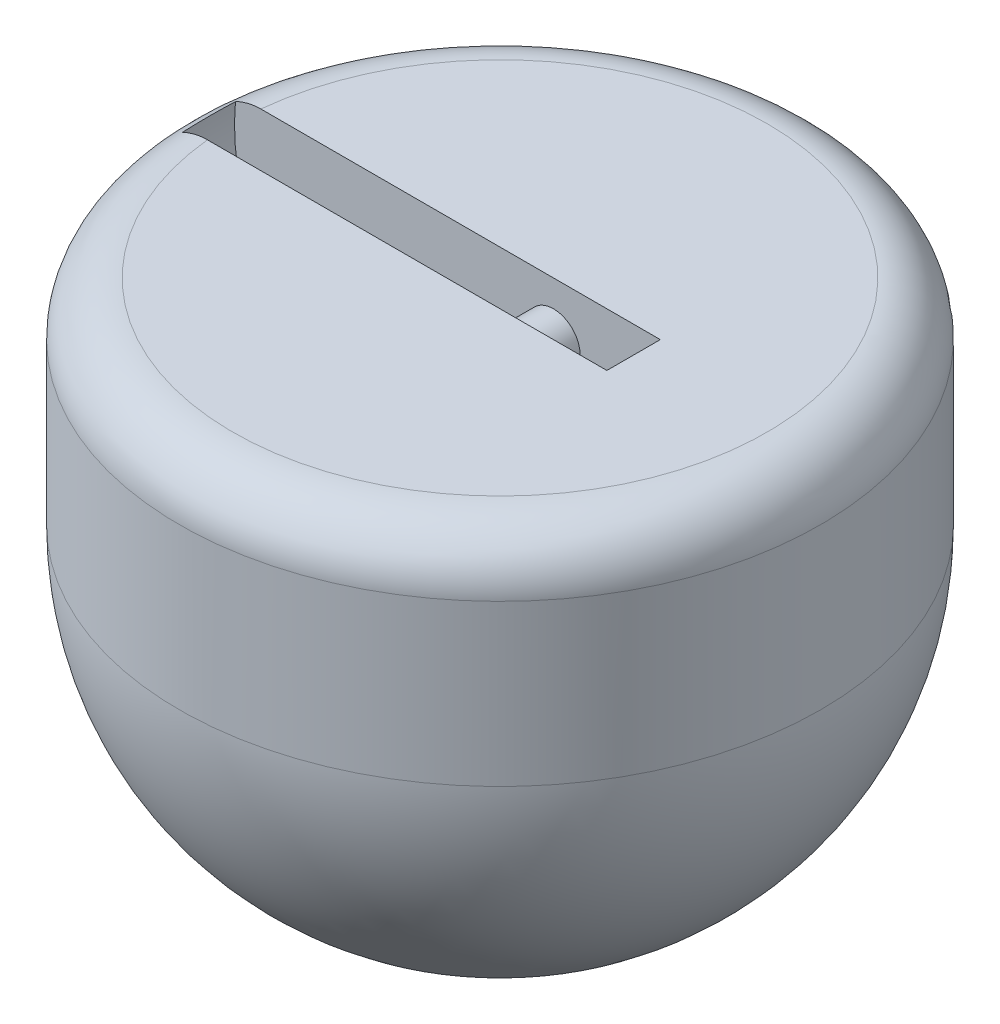
ISO-10303-21;
HEADER;
FILE_DESCRIPTION(('STEP AP214'),'2;1');
FILE_NAME('part.step','',(''),(''),'','','');
FILE_SCHEMA(('AUTOMOTIVE_DESIGN { 1 0 10303 214 1 1 1 1 }'));
ENDSEC;
DATA;
#1=APPLICATION_CONTEXT('core data for automotive mechanical design processes');
#2=APPLICATION_PROTOCOL_DEFINITION('international standard','automotive_design',2000,#1);
#3=PRODUCT_CONTEXT('',#1,'mechanical');
#4=PRODUCT('Part','Part','',(#3));
#5=PRODUCT_RELATED_PRODUCT_CATEGORY('part','',(#4));
#6=PRODUCT_DEFINITION_FORMATION('','',#4);
#7=PRODUCT_DEFINITION_CONTEXT('part definition',#1,'design');
#8=PRODUCT_DEFINITION('design','',#6,#7);
#9=PRODUCT_DEFINITION_SHAPE('','',#8);
#10=(LENGTH_UNIT() NAMED_UNIT(*) SI_UNIT(.MILLI.,.METRE.));
#11=(NAMED_UNIT(*) PLANE_ANGLE_UNIT() SI_UNIT($,.RADIAN.));
#12=(NAMED_UNIT(*) SI_UNIT($,.STERADIAN.) SOLID_ANGLE_UNIT());
#13=UNCERTAINTY_MEASURE_WITH_UNIT(LENGTH_MEASURE(1.E-05),#10,'distance_accuracy_value','');
#14=(GEOMETRIC_REPRESENTATION_CONTEXT(3) GLOBAL_UNCERTAINTY_ASSIGNED_CONTEXT((#13)) GLOBAL_UNIT_ASSIGNED_CONTEXT((#10,
#11,#12)) REPRESENTATION_CONTEXT('',''));
#15=CARTESIAN_POINT('',(0.,0.,0.));
#16=DIRECTION('',(0.,0.,1.));
#17=DIRECTION('',(1.,0.,0.));
#18=AXIS2_PLACEMENT_3D('',#15,#16,#17);
#19=CARTESIAN_POINT('',(0.,0.,0.));
#20=DIRECTION('',(0.,1.,0.));
#21=DIRECTION('',(0.,0.,1.));
#22=AXIS2_PLACEMENT_3D('',#19,#20,#21);
#23=PLANE('',#22);
#24=DIRECTION('',(-1.,0.,0.));
#25=VECTOR('',#24,1.);
#26=CARTESIAN_POINT('',(5.,0.,-1.));
#27=LINE('',#26,#25);
#28=CARTESIAN_POINT('',(5.,0.,-1.));
#29=VERTEX_POINT('',#28);
#30=CARTESIAN_POINT('',(-9.9498743710665,0.,-1.));
#31=VERTEX_POINT('',#30);
#32=EDGE_CURVE('E64',#29,#31,#27,.T.);
#33=ORIENTED_EDGE('',*,*,#32,.F.);
#34=DIRECTION('',(0.,0.,1.));
#35=VECTOR('',#34,1.);
#36=CARTESIAN_POINT('',(5.,0.,-1.));
#37=LINE('',#36,#35);
#38=CARTESIAN_POINT('',(5.,0.,1.));
#39=VERTEX_POINT('',#38);
#40=EDGE_CURVE('E85',#29,#39,#37,.T.);
#41=ORIENTED_EDGE('',*,*,#40,.T.);
#42=DIRECTION('',(-1.,0.,0.));
#43=VECTOR('',#42,1.);
#44=CARTESIAN_POINT('',(5.,0.,1.));
#45=LINE('',#44,#43);
#46=CARTESIAN_POINT('',(-9.9498743710665,0.,1.));
#47=VERTEX_POINT('',#46);
#48=EDGE_CURVE('E78',#39,#47,#45,.T.);
#49=ORIENTED_EDGE('',*,*,#48,.T.);
#50=CARTESIAN_POINT('',(0.,0.,0.));
#51=DIRECTION('',(0.,-1.,0.));
#52=DIRECTION('',(0.,0.,-1.));
#53=AXIS2_PLACEMENT_3D('',#50,#51,#52);
#54=CIRCLE('',#53,10.);
#55=EDGE_CURVE('E89',#31,#47,#54,.T.);
#56=ORIENTED_EDGE('',*,*,#55,.F.);
#57=EDGE_LOOP('',(#33,#41,#49,#56));
#58=FACE_BOUND('',#57,.T.);
#59=ADVANCED_FACE('F41',(#58),#23,.T.);
#60=CARTESIAN_POINT('',(0.,-2.,0.));
#61=DIRECTION('',(0.,-1.,0.));
#62=DIRECTION('',(0.,0.,-1.));
#63=AXIS2_PLACEMENT_3D('',#60,#61,#62);
#64=TOROIDAL_SURFACE('',#63,10.,2.);
#65=CARTESIAN_POINT('',(-10.8242334275043,-0.199297555043121,-1.));
#66=CARTESIAN_POINT('',(-10.9257054604038,-0.248139179035854,-1.));
#67=CARTESIAN_POINT('',(-11.0231377750794,-0.305557934567899,-1.));
#68=CARTESIAN_POINT('',(-11.2070704624869,-0.43597230631444,-1.));
#69=CARTESIAN_POINT('',(-11.2935580682294,-0.508985851904782,-1.));
#70=CARTESIAN_POINT('',(-11.4530114356367,-0.668497793270508,-1.));
#71=CARTESIAN_POINT('',(-11.5259813733455,-0.754992009175932,-1.));
#72=CARTESIAN_POINT('',(-11.6562962836318,-0.939010720145789,-1.));
#73=CARTESIAN_POINT('',(-11.7136451079299,-1.03653248772297,-1.));
#74=CARTESIAN_POINT('',(-11.8109532091549,-1.23958249116003,-1.));
#75=CARTESIAN_POINT('',(-11.8509577064683,-1.34508905400909,-1.));
#76=CARTESIAN_POINT('',(-11.9126368483875,-1.56133441106516,-1.));
#77=CARTESIAN_POINT('',(-11.9343110800122,-1.67207332309768,-1.));
#78=CARTESIAN_POINT('',(-11.9586679257183,-1.89533704689153,-1.));
#79=CARTESIAN_POINT('',(-11.9613982703355,-2.0078566537947,-1.));
#80=CARTESIAN_POINT('',(-11.9479150153787,-2.23175421810235,-1.));
#81=CARTESIAN_POINT('',(-11.9317015890207,-2.34313218593625,-1.));
#82=CARTESIAN_POINT('',(-11.8808176377737,-2.56150613587524,-1.));
#83=CARTESIAN_POINT('',(-11.8461599659228,-2.66850511367036,-1.));
#84=CARTESIAN_POINT('',(-11.7593943517058,-2.87517577070994,-1.));
#85=CARTESIAN_POINT('',(-11.7072863890297,-2.97484744142617,-1.));
#86=CARTESIAN_POINT('',(-11.5870418223883,-3.16417294238195,-1.));
#87=CARTESIAN_POINT('',(-11.5188855627623,-3.25381428744889,-1.));
#88=CARTESIAN_POINT('',(-11.3685310366841,-3.42042364723295,-1.));
#89=CARTESIAN_POINT('',(-11.2863325809017,-3.4973914910464,-1.));
#90=CARTESIAN_POINT('',(-11.1099756084311,-3.63671625838457,-1.));
#91=CARTESIAN_POINT('',(-11.0157828277439,-3.69902980734676,-1.));
#92=CARTESIAN_POINT('',(-10.818305467045,-3.80703093379937,-1.));
#93=CARTESIAN_POINT('',(-10.7150207083925,-3.85271818452254,-1.));
#94=CARTESIAN_POINT('',(-10.5018541004647,-3.92636375685488,-1.));
#95=CARTESIAN_POINT('',(-10.3919477162282,-3.95425106105585,-1.));
#96=CARTESIAN_POINT('',(-10.1690193431008,-3.99125564685907,-1.));
#97=CARTESIAN_POINT('',(-10.055997282353,-4.00037249519023,-1.));
#98=CARTESIAN_POINT('',(-9.8295847785201,-3.99960269171912,-1.));
#99=CARTESIAN_POINT('',(-9.71619457980172,-3.9896432240721,-1.));
#100=CARTESIAN_POINT('',(-9.49268394558884,-3.95086958948949,-1.));
#101=CARTESIAN_POINT('',(-9.38256356668763,-3.92205509641406,-1.));
#102=CARTESIAN_POINT('',(-9.16849480489789,-3.84630422516719,-1.));
#103=CARTESIAN_POINT('',(-9.06455909718188,-3.79933201621416,-1.));
#104=CARTESIAN_POINT('',(-8.86606359963075,-3.68857952169498,-1.));
#105=CARTESIAN_POINT('',(-8.77150380402485,-3.62479924647412,-1.));
#106=CARTESIAN_POINT('',(-8.59462414757433,-3.48232359469526,-1.));
#107=CARTESIAN_POINT('',(-8.51228531731116,-3.40365177408854,-1.));
#108=CARTESIAN_POINT('',(-8.36207230372604,-3.23353367455121,-1.));
#109=CARTESIAN_POINT('',(-8.29419771704558,-3.14208775196457,-1.));
#110=CARTESIAN_POINT('',(-8.17525446281042,-2.94954629656905,-1.));
#111=CARTESIAN_POINT('',(-8.12409538838126,-2.84850662111941,-1.));
#112=CARTESIAN_POINT('',(-8.03960406066904,-2.63922988469286,-1.));
#113=CARTESIAN_POINT('',(-8.00627103040308,-2.53099313764558,-1.));
#114=CARTESIAN_POINT('',(-7.95860960077374,-2.31120849463868,-1.));
#115=CARTESIAN_POINT('',(-7.9441497273926,-2.19968909982976,-1.));
#116=CARTESIAN_POINT('',(-7.93424044725219,-1.97581043988159,-1.));
#117=CARTESIAN_POINT('',(-7.9387904693458,-1.86345120007649,-1.));
#118=CARTESIAN_POINT('',(-7.96670627296362,-1.64154862165487,-1.));
#119=CARTESIAN_POINT('',(-7.98999775721574,-1.53199592313294,-1.));
#120=CARTESIAN_POINT('',(-8.05460594024829,-1.31834308173638,-1.));
#121=CARTESIAN_POINT('',(-8.09592278107696,-1.21424298183803,-1.));
#122=CARTESIAN_POINT('',(-8.19546499470476,-1.01420355677668,-1.));
#123=CARTESIAN_POINT('',(-8.25372493878907,-0.918281440973528,-1.));
#124=CARTESIAN_POINT('',(-8.38542412717523,-0.737496379449116,-1.));
#125=CARTESIAN_POINT('',(-8.45886389885065,-0.652633818123036,-1.));
#126=CARTESIAN_POINT('',(-8.61934253200508,-0.495786961745805,-1.));
#127=CARTESIAN_POINT('',(-8.70646638718297,-0.423889631940541,-1.));
#128=CARTESIAN_POINT('',(-8.89147968023287,-0.295632238853413,-1.));
#129=CARTESIAN_POINT('',(-8.9893690871969,-0.239272130965685,-1.));
#130=CARTESIAN_POINT('',(-9.1938083834499,-0.143325437428456,-1.));
#131=CARTESIAN_POINT('',(-9.30040918537551,-0.103847319698298,-1.));
#132=CARTESIAN_POINT('',(-9.51874388838062,-0.0432767192851328,-1.));
#133=CARTESIAN_POINT('',(-9.63047915301714,-0.0221891506255669,-1.));
#134=CARTESIAN_POINT('',(-9.85629384700905,0.00103226072303266,-1.));
#135=CARTESIAN_POINT('',(-9.97038017747644,0.00309870617211501,-1.));
#136=CARTESIAN_POINT('',(-10.1971820534755,-0.0119856037720281,-1.));
#137=CARTESIAN_POINT('',(-10.3098990746798,-0.0291133887652928,-1.));
#138=CARTESIAN_POINT('',(-10.4899404810384,-0.0722563206126016,-1.));
#139=CARTESIAN_POINT('',(-10.5586606285797,-0.0926562173305354,-1.));
#140=CARTESIAN_POINT('',(-10.6935428790982,-0.140647066676178,-1.));
#141=CARTESIAN_POINT('',(-10.7597049815847,-0.168238020682936,-1.));
#142=CARTESIAN_POINT('',(-10.8242334275043,-0.199297555043121,-1.));
#143=B_SPLINE_CURVE_WITH_KNOTS('',3,(#65,#66,#67,#68,#69,#70,#71,#72,#73,#74,#75,#76,#77,#78,
#79,#80,#81,#82,#83,#84,#85,#86,#87,#88,#89,#90,#91,#92,#93,#94,#95,#96,#97,#98,#99,#100,#101,
#102,#103,#104,#105,#106,#107,#108,#109,#110,#111,#112,#113,#114,#115,#116,#117,#118,#119,#120,
#121,#122,#123,#124,#125,#126,#127,#128,#129,#130,#131,#132,#133,#134,#135,#136,#137,#138,#139,
#140,#141,#142),.UNSPECIFIED.,.T.,.F.,(4,2,2,2,2,2,2,2,2,2,2,2,2,2,2,2,2,2,2,2,2,2,2,2,2,2,2,2,
2,2,2,2,2,2,2,2,2,2,4),(0.,0.337584164204723,0.675558559432851,1.01342836870058,
1.35121479334807,1.68811516129069,2.02502311939836,2.36108190352256,2.69713761485192,
3.03295944879974,3.36878167360329,3.70501736664955,4.04125759350321,4.37848085670867,
4.7157107472202,5.05427782777901,5.39285272326164,5.73272256248192,6.07259828066687,
6.41314813076086,6.7536977712485,7.09371315366308,7.43371905296525,7.77185433704961,
8.1099748816469,8.44572721593102,8.78146946270047,9.11588723677842,9.45030764627263,
9.78541526441601,10.1205345267371,10.4578241791256,10.7951128631779,11.1345372256506,
11.4740522558177,11.814769823036,12.1550800767718,12.3697577242299,12.5844354128573),.UNSPECIFIED.);
#144=CARTESIAN_POINT('',(-10.9009037574159,-0.238237913015783,-1.));
#145=VERTEX_POINT('',#144);
#146=EDGE_CURVE('E76',#31,#145,#143,.T.);
#147=ORIENTED_EDGE('',*,*,#146,.F.);
#148=ORIENTED_EDGE('',*,*,#55,.T.);
#149=CARTESIAN_POINT('',(-10.8242334275043,-0.199297555043121,1.));
#150=CARTESIAN_POINT('',(-10.9257054604038,-0.248139179035854,1.));
#151=CARTESIAN_POINT('',(-11.0231377750794,-0.305557934567899,1.));
#152=CARTESIAN_POINT('',(-11.2070704624869,-0.43597230631444,1.));
#153=CARTESIAN_POINT('',(-11.2935580682294,-0.508985851904782,1.));
#154=CARTESIAN_POINT('',(-11.4530114356367,-0.668497793270508,1.));
#155=CARTESIAN_POINT('',(-11.5259813733455,-0.754992009175932,1.));
#156=CARTESIAN_POINT('',(-11.6562962836318,-0.939010720145789,1.));
#157=CARTESIAN_POINT('',(-11.7136451079299,-1.03653248772297,1.));
#158=CARTESIAN_POINT('',(-11.8109532091549,-1.23958249116003,1.));
#159=CARTESIAN_POINT('',(-11.8509577064683,-1.34508905400909,1.));
#160=CARTESIAN_POINT('',(-11.9126368483875,-1.56133441106516,1.));
#161=CARTESIAN_POINT('',(-11.9343110800122,-1.67207332309768,1.));
#162=CARTESIAN_POINT('',(-11.9586679257183,-1.89533704689153,1.));
#163=CARTESIAN_POINT('',(-11.9613982703355,-2.0078566537947,1.));
#164=CARTESIAN_POINT('',(-11.9479150153787,-2.23175421810235,1.));
#165=CARTESIAN_POINT('',(-11.9317015890207,-2.34313218593625,1.));
#166=CARTESIAN_POINT('',(-11.8808176377737,-2.56150613587524,1.));
#167=CARTESIAN_POINT('',(-11.8461599659228,-2.66850511367036,1.));
#168=CARTESIAN_POINT('',(-11.7593943517058,-2.87517577070994,1.));
#169=CARTESIAN_POINT('',(-11.7072863890297,-2.97484744142617,1.));
#170=CARTESIAN_POINT('',(-11.5870418223883,-3.16417294238195,1.));
#171=CARTESIAN_POINT('',(-11.5188855627623,-3.25381428744889,1.));
#172=CARTESIAN_POINT('',(-11.3685310366841,-3.42042364723295,1.));
#173=CARTESIAN_POINT('',(-11.2863325809017,-3.4973914910464,1.));
#174=CARTESIAN_POINT('',(-11.1099756084311,-3.63671625838457,1.));
#175=CARTESIAN_POINT('',(-11.0157828277439,-3.69902980734676,1.));
#176=CARTESIAN_POINT('',(-10.818305467045,-3.80703093379937,1.));
#177=CARTESIAN_POINT('',(-10.7150207083925,-3.85271818452254,1.));
#178=CARTESIAN_POINT('',(-10.5018541004647,-3.92636375685488,1.));
#179=CARTESIAN_POINT('',(-10.3919477162282,-3.95425106105585,1.));
#180=CARTESIAN_POINT('',(-10.1690193431008,-3.99125564685907,1.));
#181=CARTESIAN_POINT('',(-10.055997282353,-4.00037249519023,1.));
#182=CARTESIAN_POINT('',(-9.8295847785201,-3.99960269171912,1.));
#183=CARTESIAN_POINT('',(-9.71619457980172,-3.9896432240721,1.));
#184=CARTESIAN_POINT('',(-9.49268394558884,-3.95086958948949,1.));
#185=CARTESIAN_POINT('',(-9.38256356668763,-3.92205509641406,1.));
#186=CARTESIAN_POINT('',(-9.16849480489789,-3.84630422516719,1.));
#187=CARTESIAN_POINT('',(-9.06455909718188,-3.79933201621416,1.));
#188=CARTESIAN_POINT('',(-8.86606359963075,-3.68857952169498,1.));
#189=CARTESIAN_POINT('',(-8.77150380402485,-3.62479924647412,1.));
#190=CARTESIAN_POINT('',(-8.59462414757433,-3.48232359469526,1.));
#191=CARTESIAN_POINT('',(-8.51228531731116,-3.40365177408854,1.));
#192=CARTESIAN_POINT('',(-8.36207230372604,-3.23353367455121,1.));
#193=CARTESIAN_POINT('',(-8.29419771704558,-3.14208775196457,1.));
#194=CARTESIAN_POINT('',(-8.17525446281042,-2.94954629656905,1.));
#195=CARTESIAN_POINT('',(-8.12409538838126,-2.84850662111941,1.));
#196=CARTESIAN_POINT('',(-8.03960406066904,-2.63922988469286,1.));
#197=CARTESIAN_POINT('',(-8.00627103040308,-2.53099313764558,1.));
#198=CARTESIAN_POINT('',(-7.95860960077374,-2.31120849463868,1.));
#199=CARTESIAN_POINT('',(-7.9441497273926,-2.19968909982976,1.));
#200=CARTESIAN_POINT('',(-7.93424044725219,-1.97581043988159,1.));
#201=CARTESIAN_POINT('',(-7.9387904693458,-1.86345120007649,1.));
#202=CARTESIAN_POINT('',(-7.96670627296362,-1.64154862165487,1.));
#203=CARTESIAN_POINT('',(-7.98999775721574,-1.53199592313294,1.));
#204=CARTESIAN_POINT('',(-8.05460594024829,-1.31834308173638,1.));
#205=CARTESIAN_POINT('',(-8.09592278107696,-1.21424298183803,1.));
#206=CARTESIAN_POINT('',(-8.19546499470476,-1.01420355677668,1.));
#207=CARTESIAN_POINT('',(-8.25372493878907,-0.918281440973528,1.));
#208=CARTESIAN_POINT('',(-8.38542412717523,-0.737496379449116,1.));
#209=CARTESIAN_POINT('',(-8.45886389885065,-0.652633818123036,1.));
#210=CARTESIAN_POINT('',(-8.61934253200508,-0.495786961745805,1.));
#211=CARTESIAN_POINT('',(-8.70646638718297,-0.423889631940541,1.));
#212=CARTESIAN_POINT('',(-8.89147968023287,-0.295632238853413,1.));
#213=CARTESIAN_POINT('',(-8.9893690871969,-0.239272130965685,1.));
#214=CARTESIAN_POINT('',(-9.1938083834499,-0.143325437428456,1.));
#215=CARTESIAN_POINT('',(-9.30040918537551,-0.103847319698298,1.));
#216=CARTESIAN_POINT('',(-9.51874388838062,-0.0432767192851328,1.));
#217=CARTESIAN_POINT('',(-9.63047915301714,-0.0221891506255669,1.));
#218=CARTESIAN_POINT('',(-9.85629384700905,0.00103226072303266,1.));
#219=CARTESIAN_POINT('',(-9.97038017747644,0.00309870617211501,1.));
#220=CARTESIAN_POINT('',(-10.1971820534755,-0.0119856037720281,1.));
#221=CARTESIAN_POINT('',(-10.3098990746798,-0.0291133887652928,1.));
#222=CARTESIAN_POINT('',(-10.4899404810384,-0.0722563206126016,1.));
#223=CARTESIAN_POINT('',(-10.5586606285797,-0.0926562173305354,1.));
#224=CARTESIAN_POINT('',(-10.6935428790982,-0.140647066676178,1.));
#225=CARTESIAN_POINT('',(-10.7597049815847,-0.168238020682936,1.));
#226=CARTESIAN_POINT('',(-10.8242334275043,-0.199297555043121,1.));
#227=B_SPLINE_CURVE_WITH_KNOTS('',3,(#149,#150,#151,#152,#153,#154,#155,#156,#157,#158,#159,
#160,#161,#162,#163,#164,#165,#166,#167,#168,#169,#170,#171,#172,#173,#174,#175,#176,#177,#178,
#179,#180,#181,#182,#183,#184,#185,#186,#187,#188,#189,#190,#191,#192,#193,#194,#195,#196,#197,
#198,#199,#200,#201,#202,#203,#204,#205,#206,#207,#208,#209,#210,#211,#212,#213,#214,#215,#216,
#217,#218,#219,#220,#221,#222,#223,#224,#225,#226),.UNSPECIFIED.,.T.,.F.,(4,2,2,2,2,2,2,2,2,2,2,
2,2,2,2,2,2,2,2,2,2,2,2,2,2,2,2,2,2,2,2,2,2,2,2,2,2,2,4),(0.,0.337584164204723,
0.675558559432851,1.01342836870058,1.35121479334807,1.68811516129069,2.02502311939836,
2.36108190352256,2.69713761485192,3.03295944879974,3.36878167360329,3.70501736664955,
4.04125759350321,4.37848085670867,4.7157107472202,5.05427782777901,5.39285272326164,
5.73272256248192,6.07259828066687,6.41314813076086,6.7536977712485,7.09371315366308,
7.43371905296525,7.77185433704961,8.1099748816469,8.44572721593102,8.78146946270047,
9.11588723677842,9.45030764627263,9.78541526441601,10.1205345267371,10.4578241791256,
10.7951128631779,11.1345372256506,11.4740522558177,11.814769823036,12.1550800767718,
12.3697577242299,12.5844354128573),.UNSPECIFIED.);
#228=CARTESIAN_POINT('',(-10.9009037574019,-0.23823791301712,1.));
#229=VERTEX_POINT('',#228);
#230=EDGE_CURVE('E103',#47,#229,#227,.T.);
#231=ORIENTED_EDGE('',*,*,#230,.T.);
#232=CARTESIAN_POINT('',(-10.9009047472752,-0.23824826132108,-1.00019999999998));
#233=CARTESIAN_POINT('',(-10.9004924890538,-0.233941136466965,-0.916897984341462));
#234=CARTESIAN_POINT('',(-10.9001343628179,-0.230230968095761,-0.833566643638268));
#235=CARTESIAN_POINT('',(-10.8995233481884,-0.223935137376225,-0.666862660351941));
#236=CARTESIAN_POINT('',(-10.899270457638,-0.221349451983728,-0.583490018650251));
#237=CARTESIAN_POINT('',(-10.8986653396194,-0.215177450640901,-0.333438906791319));
#238=CARTESIAN_POINT('',(-10.8984661404369,-0.213170798646531,-0.166719453395659));
#239=CARTESIAN_POINT('',(-10.8984661404369,-0.213170798646531,0.166719453395659));
#240=CARTESIAN_POINT('',(-10.8986653396194,-0.215177450640901,0.333438906791319));
#241=CARTESIAN_POINT('',(-10.899270457638,-0.221349451983728,0.583490018650251));
#242=CARTESIAN_POINT('',(-10.8995233481884,-0.223935137376224,0.666862660351941));
#243=CARTESIAN_POINT('',(-10.9001343628179,-0.230230968095761,0.833566643638268));
#244=CARTESIAN_POINT('',(-10.9004924890538,-0.233941136466966,0.916897984341462));
#245=CARTESIAN_POINT('',(-10.9009047472752,-0.238248261321081,1.00019999999998));
#246=B_SPLINE_CURVE_WITH_KNOTS('',3,(#232,#233,#234,#235,#236,#237,#238,#239,#240,#241,#242,
#243,#244,#245),.UNSPECIFIED.,.F.,.F.,(4,2,2,2,2,2,4),(0.,0.250237729780698,0.500470331168158,
1.00061183689406,1.50075334261997,1.75098594400743,2.00122367378813),.UNSPECIFIED.);
#247=EDGE_CURVE('E109',#145,#229,#246,.T.);
#248=ORIENTED_EDGE('',*,*,#247,.F.);
#249=EDGE_LOOP('',(#147,#148,#231,#248));
#250=FACE_BOUND('',#249,.T.);
#251=CARTESIAN_POINT('',(0.,-2.,0.));
#252=DIRECTION('',(0.,-1.,0.));
#253=DIRECTION('',(0.,0.,-1.));
#254=AXIS2_PLACEMENT_3D('',#251,#252,#253);
#255=CIRCLE('',#254,12.);
#256=CARTESIAN_POINT('',(0.,-2.,-12.));
#257=VERTEX_POINT('',#256);
#258=EDGE_CURVE('E97',#257,#257,#255,.T.);
#259=ORIENTED_EDGE('',*,*,#258,.F.);
#260=EDGE_LOOP('',(#259));
#261=FACE_BOUND('',#260,.T.);
#262=ADVANCED_FACE('F117',(#250,#261),#64,.T.);
#263=CARTESIAN_POINT('',(0.,-20.,0.));
#264=DIRECTION('',(0.,-1.,0.));
#265=DIRECTION('',(0.,0.,-1.));
#266=AXIS2_PLACEMENT_3D('',#263,#264,#265);
#267=CYLINDRICAL_SURFACE('',#266,12.);
#268=ORIENTED_EDGE('',*,*,#258,.T.);
#269=EDGE_LOOP('',(#268));
#270=FACE_BOUND('',#269,.T.);
#271=CARTESIAN_POINT('',(0.,-8.,0.));
#272=DIRECTION('',(0.,-1.,0.));
#273=DIRECTION('',(0.,0.,-1.));
#274=AXIS2_PLACEMENT_3D('',#271,#272,#273);
#275=CIRCLE('',#274,12.);
#276=CARTESIAN_POINT('',(0.,-8.,-12.));
#277=VERTEX_POINT('',#276);
#278=EDGE_CURVE('E88',#277,#277,#275,.T.);
#279=ORIENTED_EDGE('',*,*,#278,.F.);
#280=EDGE_LOOP('',(#279));
#281=FACE_BOUND('',#280,.T.);
#282=ADVANCED_FACE('F134',(#270,#281),#267,.T.);
#283=CARTESIAN_POINT('',(0.,-8.,0.));
#284=DIRECTION('',(0.,-1.,0.));
#285=DIRECTION('',(1.,0.,0.));
#286=AXIS2_PLACEMENT_3D('',#283,#284,#285);
#287=SPHERICAL_SURFACE('',#286,12.);
#288=ORIENTED_EDGE('',*,*,#278,.T.);
#289=EDGE_LOOP('',(#288));
#290=FACE_BOUND('',#289,.T.);
#291=ADVANCED_FACE('F131',(#290),#287,.T.);
#292=CARTESIAN_POINT('',(-2.93725393319377,-1.,-1.));
#293=DIRECTION('',(0.,0.,1.));
#294=DIRECTION('',(1.,0.,0.));
#295=AXIS2_PLACEMENT_3D('',#292,#293,#294);
#296=CYLINDRICAL_SURFACE('',#295,8.);
#297=ORIENTED_EDGE('',*,*,#247,.T.);
#298=CARTESIAN_POINT('',(-2.93725393319377,-1.,1.));
#299=DIRECTION('',(0.,0.,1.));
#300=DIRECTION('',(-1.,0.,0.));
#301=AXIS2_PLACEMENT_3D('',#298,#299,#300);
#302=CIRCLE('',#301,8.);
#303=EDGE_CURVE('E54',#229,#39,#302,.T.);
#304=ORIENTED_EDGE('',*,*,#303,.T.);
#305=ORIENTED_EDGE('',*,*,#40,.F.);
#306=CARTESIAN_POINT('',(-2.93725393319377,-1.,-1.));
#307=DIRECTION('',(0.,0.,1.));
#308=DIRECTION('',(-1.,0.,0.));
#309=AXIS2_PLACEMENT_3D('',#306,#307,#308);
#310=CIRCLE('',#309,8.);
#311=EDGE_CURVE('E71',#145,#29,#310,.T.);
#312=ORIENTED_EDGE('',*,*,#311,.F.);
#313=EDGE_LOOP('',(#297,#304,#305,#312));
#314=FACE_BOUND('',#313,.T.);
#315=ADVANCED_FACE('F82',(#314),#296,.F.);
#316=CARTESIAN_POINT('',(-2.93725393319377,-1.,-1.));
#317=DIRECTION('',(0.,0.,-1.));
#318=DIRECTION('',(-1.,0.,0.));
#319=AXIS2_PLACEMENT_3D('',#316,#317,#318);
#320=PLANE('',#319);
#321=CARTESIAN_POINT('',(-3.,-5.,-1.));
#322=DIRECTION('',(0.,0.,-1.));
#323=DIRECTION('',(-1.,0.,0.));
#324=AXIS2_PLACEMENT_3D('',#321,#322,#323);
#325=CIRCLE('',#324,1.);
#326=CARTESIAN_POINT('',(-4.,-5.,-1.));
#327=VERTEX_POINT('',#326);
#328=EDGE_CURVE('E11',#327,#327,#325,.F.);
#329=ORIENTED_EDGE('',*,*,#328,.F.);
#330=EDGE_LOOP('',(#329));
#331=FACE_BOUND('',#330,.T.);
#332=CARTESIAN_POINT('',(1.,-2.,-1.));
#333=DIRECTION('',(0.,0.,-1.));
#334=DIRECTION('',(-1.,0.,0.));
#335=AXIS2_PLACEMENT_3D('',#332,#333,#334);
#336=CIRCLE('',#335,1.);
#337=CARTESIAN_POINT('',(0.,-2.,-1.));
#338=VERTEX_POINT('',#337);
#339=EDGE_CURVE('E48',#338,#338,#336,.F.);
#340=ORIENTED_EDGE('',*,*,#339,.F.);
#341=EDGE_LOOP('',(#340));
#342=FACE_BOUND('',#341,.T.);
#343=ORIENTED_EDGE('',*,*,#146,.T.);
#344=ORIENTED_EDGE('',*,*,#311,.T.);
#345=ORIENTED_EDGE('',*,*,#32,.T.);
#346=EDGE_LOOP('',(#343,#344,#345));
#347=FACE_BOUND('',#346,.T.);
#348=ADVANCED_FACE('F73',(#331,#342,#347),#320,.F.);
#349=CARTESIAN_POINT('',(-2.93725393319377,-1.,1.));
#350=DIRECTION('',(0.,0.,-1.));
#351=DIRECTION('',(-1.,0.,0.));
#352=AXIS2_PLACEMENT_3D('',#349,#350,#351);
#353=PLANE('',#352);
#354=CARTESIAN_POINT('',(-3.,-5.,1.));
#355=DIRECTION('',(0.,0.,1.));
#356=DIRECTION('',(1.,0.,0.));
#357=AXIS2_PLACEMENT_3D('',#354,#355,#356);
#358=CIRCLE('',#357,1.);
#359=CARTESIAN_POINT('',(-2.,-5.,1.));
#360=VERTEX_POINT('',#359);
#361=EDGE_CURVE('E206',#360,#360,#358,.T.);
#362=ORIENTED_EDGE('',*,*,#361,.T.);
#363=EDGE_LOOP('',(#362));
#364=FACE_BOUND('',#363,.T.);
#365=CARTESIAN_POINT('',(1.,-2.,1.));
#366=DIRECTION('',(0.,0.,1.));
#367=DIRECTION('',(1.,0.,0.));
#368=AXIS2_PLACEMENT_3D('',#365,#366,#367);
#369=CIRCLE('',#368,1.);
#370=CARTESIAN_POINT('',(2.,-2.,1.));
#371=VERTEX_POINT('',#370);
#372=EDGE_CURVE('E92',#371,#371,#369,.T.);
#373=ORIENTED_EDGE('',*,*,#372,.T.);
#374=EDGE_LOOP('',(#373));
#375=FACE_BOUND('',#374,.T.);
#376=ORIENTED_EDGE('',*,*,#48,.F.);
#377=ORIENTED_EDGE('',*,*,#303,.F.);
#378=ORIENTED_EDGE('',*,*,#230,.F.);
#379=EDGE_LOOP('',(#376,#377,#378));
#380=FACE_BOUND('',#379,.T.);
#381=ADVANCED_FACE('F120',(#364,#375,#380),#353,.T.);
#382=CARTESIAN_POINT('',(1.,-2.,1.));
#383=DIRECTION('',(0.,0.,-1.));
#384=DIRECTION('',(-1.,0.,0.));
#385=AXIS2_PLACEMENT_3D('',#382,#383,#384);
#386=CYLINDRICAL_SURFACE('',#385,1.);
#387=ORIENTED_EDGE('',*,*,#372,.F.);
#388=EDGE_LOOP('',(#387));
#389=FACE_BOUND('',#388,.T.);
#390=ORIENTED_EDGE('',*,*,#339,.T.);
#391=EDGE_LOOP('',(#390));
#392=FACE_BOUND('',#391,.T.);
#393=ADVANCED_FACE('F123',(#389,#392),#386,.T.);
#394=CARTESIAN_POINT('',(-3.,-5.,1.));
#395=DIRECTION('',(0.,0.,-1.));
#396=DIRECTION('',(-1.,0.,0.));
#397=AXIS2_PLACEMENT_3D('',#394,#395,#396);
#398=CYLINDRICAL_SURFACE('',#397,1.);
#399=ORIENTED_EDGE('',*,*,#361,.F.);
#400=EDGE_LOOP('',(#399));
#401=FACE_BOUND('',#400,.T.);
#402=ORIENTED_EDGE('',*,*,#328,.T.);
#403=EDGE_LOOP('',(#402));
#404=FACE_BOUND('',#403,.T.);
#405=ADVANCED_FACE('F176',(#401,#404),#398,.T.);
#406=CLOSED_SHELL('',(#59,#262,#282,#291,#315,#348,#381,#393,#405));
#407=MANIFOLD_SOLID_BREP('B2',#406);
#408=ADVANCED_BREP_SHAPE_REPRESENTATION('',(#18,#407),#14);
#409=SHAPE_DEFINITION_REPRESENTATION(#9,#408);
ENDSEC;
END-ISO-10303-21;
